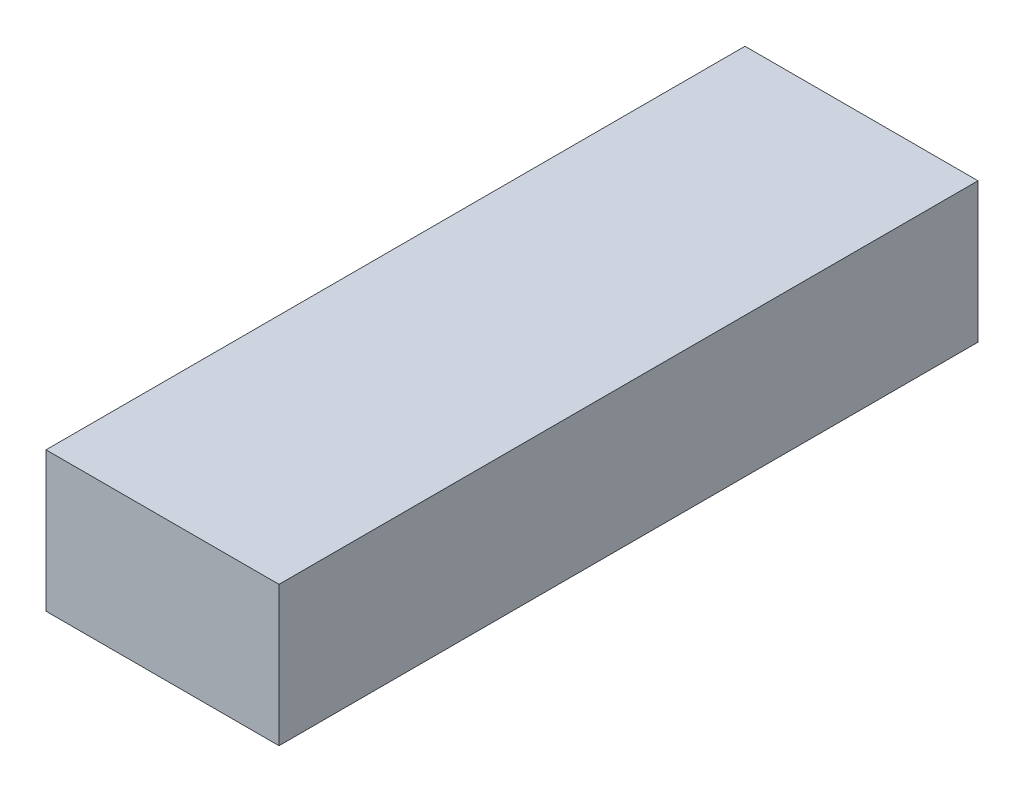
ISO-10303-21;
HEADER;
FILE_DESCRIPTION(('STEP AP214'),'2;1');
FILE_NAME('part.step','',(''),(''),'','','');
FILE_SCHEMA(('AUTOMOTIVE_DESIGN { 1 0 10303 214 1 1 1 1 }'));
ENDSEC;
DATA;
#1=APPLICATION_CONTEXT('core data for automotive mechanical design processes');
#2=APPLICATION_PROTOCOL_DEFINITION('international standard','automotive_design',2000,#1);
#3=PRODUCT_CONTEXT('',#1,'mechanical');
#4=PRODUCT('Part','Part','',(#3));
#5=PRODUCT_RELATED_PRODUCT_CATEGORY('part','',(#4));
#6=PRODUCT_DEFINITION_FORMATION('','',#4);
#7=PRODUCT_DEFINITION_CONTEXT('part definition',#1,'design');
#8=PRODUCT_DEFINITION('design','',#6,#7);
#9=PRODUCT_DEFINITION_SHAPE('','',#8);
#10=(LENGTH_UNIT() NAMED_UNIT(*) SI_UNIT(.MILLI.,.METRE.));
#11=(NAMED_UNIT(*) PLANE_ANGLE_UNIT() SI_UNIT($,.RADIAN.));
#12=(NAMED_UNIT(*) SI_UNIT($,.STERADIAN.) SOLID_ANGLE_UNIT());
#13=UNCERTAINTY_MEASURE_WITH_UNIT(LENGTH_MEASURE(1.E-05),#10,'distance_accuracy_value','');
#14=(GEOMETRIC_REPRESENTATION_CONTEXT(3) GLOBAL_UNCERTAINTY_ASSIGNED_CONTEXT((#13)) GLOBAL_UNIT_ASSIGNED_CONTEXT((#10,
#11,#12)) REPRESENTATION_CONTEXT('',''));
#15=CARTESIAN_POINT('',(0.,0.,0.));
#16=DIRECTION('',(0.,0.,1.));
#17=DIRECTION('',(1.,0.,0.));
#18=AXIS2_PLACEMENT_3D('',#15,#16,#17);
#19=CARTESIAN_POINT('',(-65.71281292104,37.,-79.99999999968));
#20=DIRECTION('',(4.806710585115E-13,0.,1.));
#21=DIRECTION('',(1.,0.,-4.806710585115E-13));
#22=AXIS2_PLACEMENT_3D('',#19,#20,#21);
#23=PLANE('',#22);
#24=DIRECTION('',(1.,0.,-4.806710585115E-13));
#25=VECTOR('',#24,1.);
#26=CARTESIAN_POINT('',(-65.71281292104,31.,-79.99999999968));
#27=LINE('',#26,#25);
#28=CARTESIAN_POINT('',(-65.71281292104,31.,-79.99999999969));
#29=VERTEX_POINT('',#28);
#30=CARTESIAN_POINT('',(-55.71281292104,31.,-79.99999999966));
#31=VERTEX_POINT('',#30);
#32=EDGE_CURVE('E25',#29,#31,#27,.T.);
#33=ORIENTED_EDGE('',*,*,#32,.T.);
#34=DIRECTION('',(0.,-1.,0.));
#35=VECTOR('',#34,1.);
#36=CARTESIAN_POINT('',(-55.71281292104,37.,-79.99999999966));
#37=LINE('',#36,#35);
#38=CARTESIAN_POINT('',(-55.71281292104,37.,-79.99999999966));
#39=VERTEX_POINT('',#38);
#40=EDGE_CURVE('E97',#39,#31,#37,.T.);
#41=ORIENTED_EDGE('',*,*,#40,.F.);
#42=DIRECTION('',(1.,0.,-4.806710585115E-13));
#43=VECTOR('',#42,1.);
#44=CARTESIAN_POINT('',(-65.71281292104,37.,-79.99999999968));
#45=LINE('',#44,#43);
#46=CARTESIAN_POINT('',(-65.71281292104,37.,-79.99999999969));
#47=VERTEX_POINT('',#46);
#48=EDGE_CURVE('E77',#47,#39,#45,.T.);
#49=ORIENTED_EDGE('',*,*,#48,.F.);
#50=DIRECTION('',(0.,-1.,0.));
#51=VECTOR('',#50,1.);
#52=CARTESIAN_POINT('',(-65.71281292104,37.,-79.99999999968));
#53=LINE('',#52,#51);
#54=EDGE_CURVE('E90',#47,#29,#53,.T.);
#55=ORIENTED_EDGE('',*,*,#54,.T.);
#56=EDGE_LOOP('',(#33,#41,#49,#55));
#57=FACE_BOUND('',#56,.T.);
#58=ADVANCED_FACE('F17',(#57),#23,.T.);
#59=CARTESIAN_POINT('',(-65.71281292088,37.,-109.9999999999));
#60=DIRECTION('',(4.806710585115E-13,0.,1.));
#61=DIRECTION('',(1.,0.,-4.806710585115E-13));
#62=AXIS2_PLACEMENT_3D('',#59,#60,#61);
#63=PLANE('',#62);
#64=DIRECTION('',(0.,-1.,0.));
#65=VECTOR('',#64,1.);
#66=CARTESIAN_POINT('',(-65.71281292088,37.,-109.9999999999));
#67=LINE('',#66,#65);
#68=CARTESIAN_POINT('',(-65.71281292088,37.,-109.9999999999));
#69=VERTEX_POINT('',#68);
#70=CARTESIAN_POINT('',(-65.71281292088,31.,-109.9999999999));
#71=VERTEX_POINT('',#70);
#72=EDGE_CURVE('E80',#69,#71,#67,.T.);
#73=ORIENTED_EDGE('',*,*,#72,.F.);
#74=DIRECTION('',(1.,0.,-4.806710585115E-13));
#75=VECTOR('',#74,1.);
#76=CARTESIAN_POINT('',(-65.71281292088,37.,-109.9999999999));
#77=LINE('',#76,#75);
#78=CARTESIAN_POINT('',(-55.71281292098,37.,-109.9999999999));
#79=VERTEX_POINT('',#78);
#80=EDGE_CURVE('E37',#69,#79,#77,.T.);
#81=ORIENTED_EDGE('',*,*,#80,.T.);
#82=DIRECTION('',(0.,-1.,0.));
#83=VECTOR('',#82,1.);
#84=CARTESIAN_POINT('',(-55.71281292098,37.,-109.9999999999));
#85=LINE('',#84,#83);
#86=CARTESIAN_POINT('',(-55.71281292098,31.,-109.9999999999));
#87=VERTEX_POINT('',#86);
#88=EDGE_CURVE('E108',#79,#87,#85,.T.);
#89=ORIENTED_EDGE('',*,*,#88,.T.);
#90=DIRECTION('',(1.,0.,-4.806710585115E-13));
#91=VECTOR('',#90,1.);
#92=CARTESIAN_POINT('',(-65.71281292088,31.,-109.9999999999));
#93=LINE('',#92,#91);
#94=EDGE_CURVE('E11',#71,#87,#93,.T.);
#95=ORIENTED_EDGE('',*,*,#94,.F.);
#96=EDGE_LOOP('',(#73,#81,#89,#95));
#97=FACE_BOUND('',#96,.T.);
#98=ADVANCED_FACE('F81',(#97),#63,.F.);
#99=CARTESIAN_POINT('',(-65.71281292088,31.,-109.9999999999));
#100=DIRECTION('',(0.,-1.,0.));
#101=DIRECTION('',(-1.,0.,0.));
#102=AXIS2_PLACEMENT_3D('',#99,#100,#101);
#103=PLANE('',#102);
#104=DIRECTION('',(4.806710585115E-13,0.,1.));
#105=VECTOR('',#104,1.);
#106=CARTESIAN_POINT('',(-55.71281292098,31.,-109.9999999999));
#107=LINE('',#106,#105);
#108=EDGE_CURVE('E103',#87,#31,#107,.T.);
#109=ORIENTED_EDGE('',*,*,#108,.T.);
#110=ORIENTED_EDGE('',*,*,#32,.F.);
#111=DIRECTION('',(4.806710585115E-13,0.,1.));
#112=VECTOR('',#111,1.);
#113=CARTESIAN_POINT('',(-65.71281292088,31.,-109.9999999999));
#114=LINE('',#113,#112);
#115=EDGE_CURVE('E85',#71,#29,#114,.T.);
#116=ORIENTED_EDGE('',*,*,#115,.F.);
#117=ORIENTED_EDGE('',*,*,#94,.T.);
#118=EDGE_LOOP('',(#109,#110,#116,#117));
#119=FACE_BOUND('',#118,.T.);
#120=ADVANCED_FACE('F119',(#119),#103,.T.);
#121=CARTESIAN_POINT('',(-65.71281292088,37.,-109.9999999999));
#122=DIRECTION('',(0.,-1.,0.));
#123=DIRECTION('',(-1.,0.,0.));
#124=AXIS2_PLACEMENT_3D('',#121,#122,#123);
#125=PLANE('',#124);
#126=ORIENTED_EDGE('',*,*,#80,.F.);
#127=DIRECTION('',(4.806710585115E-13,0.,1.));
#128=VECTOR('',#127,1.);
#129=CARTESIAN_POINT('',(-65.71281292088,37.,-109.9999999999));
#130=LINE('',#129,#128);
#131=EDGE_CURVE('E72',#69,#47,#130,.T.);
#132=ORIENTED_EDGE('',*,*,#131,.T.);
#133=ORIENTED_EDGE('',*,*,#48,.T.);
#134=DIRECTION('',(4.806710585115E-13,0.,1.));
#135=VECTOR('',#134,1.);
#136=CARTESIAN_POINT('',(-55.71281292098,37.,-109.9999999999));
#137=LINE('',#136,#135);
#138=EDGE_CURVE('E74',#79,#39,#137,.T.);
#139=ORIENTED_EDGE('',*,*,#138,.F.);
#140=EDGE_LOOP('',(#126,#132,#133,#139));
#141=FACE_BOUND('',#140,.T.);
#142=ADVANCED_FACE('F70',(#141),#125,.F.);
#143=CARTESIAN_POINT('',(-55.71281292098,37.,-109.9999999999));
#144=DIRECTION('',(1.,0.,-4.806710585115E-13));
#145=DIRECTION('',(-4.806710585115E-13,0.,-1.));
#146=AXIS2_PLACEMENT_3D('',#143,#144,#145);
#147=PLANE('',#146);
#148=ORIENTED_EDGE('',*,*,#40,.T.);
#149=ORIENTED_EDGE('',*,*,#108,.F.);
#150=ORIENTED_EDGE('',*,*,#88,.F.);
#151=ORIENTED_EDGE('',*,*,#138,.T.);
#152=EDGE_LOOP('',(#148,#149,#150,#151));
#153=FACE_BOUND('',#152,.T.);
#154=ADVANCED_FACE('F116',(#153),#147,.T.);
#155=CARTESIAN_POINT('',(-65.71281292088,37.,-109.9999999999));
#156=DIRECTION('',(1.,0.,-4.806710585115E-13));
#157=DIRECTION('',(-4.806710585115E-13,0.,-1.));
#158=AXIS2_PLACEMENT_3D('',#155,#156,#157);
#159=PLANE('',#158);
#160=ORIENTED_EDGE('',*,*,#131,.F.);
#161=ORIENTED_EDGE('',*,*,#72,.T.);
#162=ORIENTED_EDGE('',*,*,#115,.T.);
#163=ORIENTED_EDGE('',*,*,#54,.F.);
#164=EDGE_LOOP('',(#160,#161,#162,#163));
#165=FACE_BOUND('',#164,.T.);
#166=ADVANCED_FACE('F88',(#165),#159,.F.);
#167=CLOSED_SHELL('',(#58,#98,#120,#142,#154,#166));
#168=MANIFOLD_SOLID_BREP('B1',#167);
#169=ADVANCED_BREP_SHAPE_REPRESENTATION('',(#18,#168),#14);
#170=SHAPE_DEFINITION_REPRESENTATION(#9,#169);
ENDSEC;
END-ISO-10303-21;
